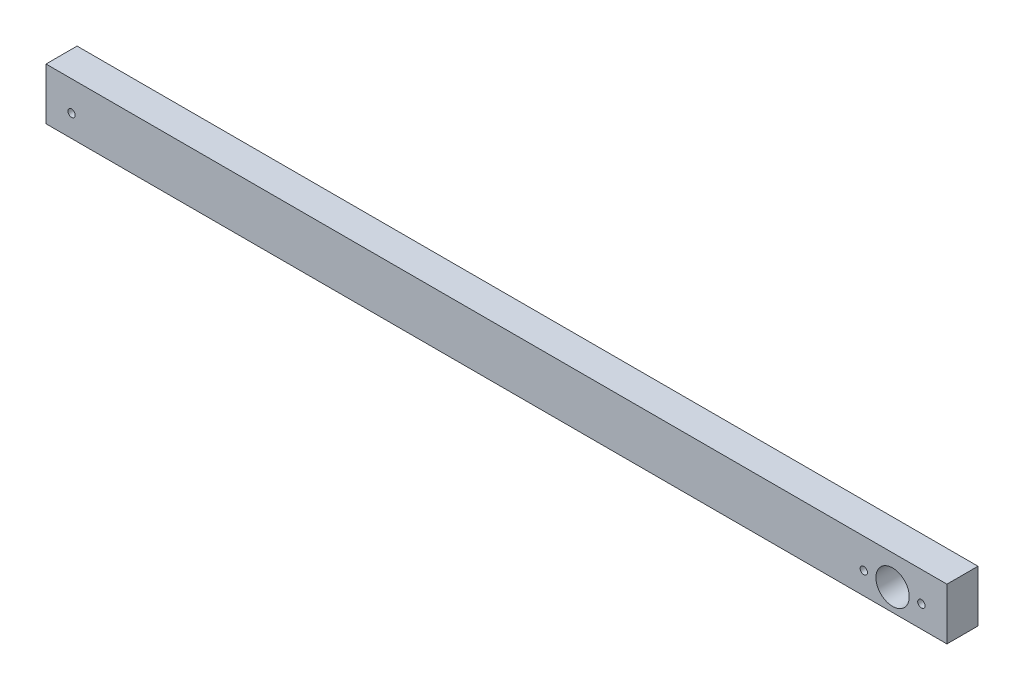
ISO-10303-21;
HEADER;
FILE_DESCRIPTION(('STEP AP214'),'2;1');
FILE_NAME('part.step','',(''),(''),'','','');
FILE_SCHEMA(('AUTOMOTIVE_DESIGN { 1 0 10303 214 1 1 1 1 }'));
ENDSEC;
DATA;
#1=APPLICATION_CONTEXT('core data for automotive mechanical design processes');
#2=APPLICATION_PROTOCOL_DEFINITION('international standard','automotive_design',2000,#1);
#3=PRODUCT_CONTEXT('',#1,'mechanical');
#4=PRODUCT('Part','Part','',(#3));
#5=PRODUCT_RELATED_PRODUCT_CATEGORY('part','',(#4));
#6=PRODUCT_DEFINITION_FORMATION('','',#4);
#7=PRODUCT_DEFINITION_CONTEXT('part definition',#1,'design');
#8=PRODUCT_DEFINITION('design','',#6,#7);
#9=PRODUCT_DEFINITION_SHAPE('','',#8);
#10=(LENGTH_UNIT() NAMED_UNIT(*) SI_UNIT(.MILLI.,.METRE.));
#11=(NAMED_UNIT(*) PLANE_ANGLE_UNIT() SI_UNIT($,.RADIAN.));
#12=(NAMED_UNIT(*) SI_UNIT($,.STERADIAN.) SOLID_ANGLE_UNIT());
#13=UNCERTAINTY_MEASURE_WITH_UNIT(LENGTH_MEASURE(1.E-05),#10,'distance_accuracy_value','');
#14=(GEOMETRIC_REPRESENTATION_CONTEXT(3) GLOBAL_UNCERTAINTY_ASSIGNED_CONTEXT((#13)) GLOBAL_UNIT_ASSIGNED_CONTEXT((#10,
#11,#12)) REPRESENTATION_CONTEXT('',''));
#15=CARTESIAN_POINT('',(0.,0.,0.));
#16=DIRECTION('',(0.,0.,1.));
#17=DIRECTION('',(1.,0.,0.));
#18=AXIS2_PLACEMENT_3D('',#15,#16,#17);
#19=CARTESIAN_POINT('',(276.225,31.75,9.525));
#20=DIRECTION('',(-1.,0.,0.));
#21=DIRECTION('',(0.,0.,1.));
#22=AXIS2_PLACEMENT_3D('',#19,#20,#21);
#23=PLANE('',#22);
#24=DIRECTION('',(0.,0.,-1.));
#25=VECTOR('',#24,1.);
#26=CARTESIAN_POINT('',(276.225,0.,9.525));
#27=LINE('',#26,#25);
#28=CARTESIAN_POINT('',(276.225,0.,9.525));
#29=VERTEX_POINT('',#28);
#30=CARTESIAN_POINT('',(276.225,0.,-9.525));
#31=VERTEX_POINT('',#30);
#32=EDGE_CURVE('E98',#29,#31,#27,.T.);
#33=ORIENTED_EDGE('',*,*,#32,.T.);
#34=DIRECTION('',(0.,-1.,0.));
#35=VECTOR('',#34,1.);
#36=CARTESIAN_POINT('',(276.225,31.75,-9.525));
#37=LINE('',#36,#35);
#38=CARTESIAN_POINT('',(276.225,31.75,-9.525));
#39=VERTEX_POINT('',#38);
#40=EDGE_CURVE('E11',#39,#31,#37,.T.);
#41=ORIENTED_EDGE('',*,*,#40,.F.);
#42=DIRECTION('',(0.,0.,-1.));
#43=VECTOR('',#42,1.);
#44=CARTESIAN_POINT('',(276.225,31.75,9.525));
#45=LINE('',#44,#43);
#46=CARTESIAN_POINT('',(276.225,31.75,9.525));
#47=VERTEX_POINT('',#46);
#48=EDGE_CURVE('E86',#47,#39,#45,.T.);
#49=ORIENTED_EDGE('',*,*,#48,.F.);
#50=DIRECTION('',(0.,-1.,0.));
#51=VECTOR('',#50,1.);
#52=CARTESIAN_POINT('',(276.225,31.75,9.525));
#53=LINE('',#52,#51);
#54=EDGE_CURVE('E94',#47,#29,#53,.T.);
#55=ORIENTED_EDGE('',*,*,#54,.T.);
#56=EDGE_LOOP('',(#33,#41,#49,#55));
#57=FACE_BOUND('',#56,.T.);
#58=ADVANCED_FACE('F35',(#57),#23,.F.);
#59=CARTESIAN_POINT('',(-276.225,31.75,-9.525));
#60=DIRECTION('',(0.,0.,1.));
#61=DIRECTION('',(1.,0.,0.));
#62=AXIS2_PLACEMENT_3D('',#59,#60,#61);
#63=PLANE('',#62);
#64=CARTESIAN_POINT('',(-260.54685,13.4937499999999,-9.525));
#65=DIRECTION('',(0.,0.,-1.));
#66=DIRECTION('',(-1.,0.,0.));
#67=AXIS2_PLACEMENT_3D('',#64,#65,#66);
#68=CIRCLE('',#67,4.21640000000001);
#69=CARTESIAN_POINT('',(-264.76325,13.4937499999999,-9.525));
#70=VERTEX_POINT('',#69);
#71=EDGE_CURVE('E141',#70,#70,#68,.T.);
#72=ORIENTED_EDGE('',*,*,#71,.F.);
#73=EDGE_LOOP('',(#72));
#74=FACE_BOUND('',#73,.T.);
#75=CARTESIAN_POINT('',(260.54685,13.4937499999999,-9.525));
#76=DIRECTION('',(0.,0.,-1.));
#77=DIRECTION('',(-1.,0.,0.));
#78=AXIS2_PLACEMENT_3D('',#75,#76,#77);
#79=CIRCLE('',#78,4.55929999999999);
#80=CARTESIAN_POINT('',(255.98755,13.4937499999999,-9.525));
#81=VERTEX_POINT('',#80);
#82=EDGE_CURVE('E132',#81,#81,#79,.T.);
#83=ORIENTED_EDGE('',*,*,#82,.F.);
#84=EDGE_LOOP('',(#83));
#85=FACE_BOUND('',#84,.T.);
#86=CARTESIAN_POINT('',(225.22815,13.4937499999999,-9.525));
#87=DIRECTION('',(0.,0.,-1.));
#88=DIRECTION('',(-1.,0.,0.));
#89=AXIS2_PLACEMENT_3D('',#86,#87,#88);
#90=CIRCLE('',#89,4.55929999999999);
#91=CARTESIAN_POINT('',(220.66885,13.4937499999999,-9.525));
#92=VERTEX_POINT('',#91);
#93=EDGE_CURVE('E123',#92,#92,#90,.T.);
#94=ORIENTED_EDGE('',*,*,#93,.F.);
#95=EDGE_LOOP('',(#94));
#96=FACE_BOUND('',#95,.T.);
#97=CARTESIAN_POINT('',(242.8875,13.4937499999999,-9.525));
#98=DIRECTION('',(0.,0.,-1.));
#99=DIRECTION('',(-1.,0.,0.));
#100=AXIS2_PLACEMENT_3D('',#97,#98,#99);
#101=CIRCLE('',#100,10.2235);
#102=CARTESIAN_POINT('',(232.664,13.4937499999999,-9.525));
#103=VERTEX_POINT('',#102);
#104=EDGE_CURVE('E112',#103,#103,#101,.T.);
#105=ORIENTED_EDGE('',*,*,#104,.F.);
#106=EDGE_LOOP('',(#105));
#107=FACE_BOUND('',#106,.T.);
#108=DIRECTION('',(-1.,0.,0.));
#109=VECTOR('',#108,1.);
#110=CARTESIAN_POINT('',(-276.225,0.,-9.525));
#111=LINE('',#110,#109);
#112=CARTESIAN_POINT('',(-276.225,0.,-9.525));
#113=VERTEX_POINT('',#112);
#114=EDGE_CURVE('E90',#31,#113,#111,.T.);
#115=ORIENTED_EDGE('',*,*,#114,.T.);
#116=DIRECTION('',(0.,-1.,0.));
#117=VECTOR('',#116,1.);
#118=CARTESIAN_POINT('',(-276.225,31.75,-9.525));
#119=LINE('',#118,#117);
#120=CARTESIAN_POINT('',(-276.225,31.75,-9.525));
#121=VERTEX_POINT('',#120);
#122=EDGE_CURVE('E43',#121,#113,#119,.T.);
#123=ORIENTED_EDGE('',*,*,#122,.F.);
#124=DIRECTION('',(-1.,0.,0.));
#125=VECTOR('',#124,1.);
#126=CARTESIAN_POINT('',(-276.225,31.75,-9.525));
#127=LINE('',#126,#125);
#128=EDGE_CURVE('E81',#39,#121,#127,.T.);
#129=ORIENTED_EDGE('',*,*,#128,.F.);
#130=ORIENTED_EDGE('',*,*,#40,.T.);
#131=EDGE_LOOP('',(#115,#123,#129,#130));
#132=FACE_BOUND('',#131,.T.);
#133=ADVANCED_FACE('F89',(#74,#85,#96,#107,#132),#63,.F.);
#134=CARTESIAN_POINT('',(-276.225,31.75,9.525));
#135=DIRECTION('',(1.,0.,0.));
#136=DIRECTION('',(0.,0.,-1.));
#137=AXIS2_PLACEMENT_3D('',#134,#135,#136);
#138=PLANE('',#137);
#139=DIRECTION('',(0.,0.,1.));
#140=VECTOR('',#139,1.);
#141=CARTESIAN_POINT('',(-276.225,0.,9.525));
#142=LINE('',#141,#140);
#143=CARTESIAN_POINT('',(-276.225,0.,9.525));
#144=VERTEX_POINT('',#143);
#145=EDGE_CURVE('E68',#113,#144,#142,.T.);
#146=ORIENTED_EDGE('',*,*,#145,.T.);
#147=DIRECTION('',(0.,-1.,0.));
#148=VECTOR('',#147,1.);
#149=CARTESIAN_POINT('',(-276.225,31.75,9.525));
#150=LINE('',#149,#148);
#151=CARTESIAN_POINT('',(-276.225,31.75,9.525));
#152=VERTEX_POINT('',#151);
#153=EDGE_CURVE('E91',#152,#144,#150,.T.);
#154=ORIENTED_EDGE('',*,*,#153,.F.);
#155=DIRECTION('',(0.,0.,1.));
#156=VECTOR('',#155,1.);
#157=CARTESIAN_POINT('',(-276.225,31.75,9.525));
#158=LINE('',#157,#156);
#159=EDGE_CURVE('E84',#121,#152,#158,.T.);
#160=ORIENTED_EDGE('',*,*,#159,.F.);
#161=ORIENTED_EDGE('',*,*,#122,.T.);
#162=EDGE_LOOP('',(#146,#154,#160,#161));
#163=FACE_BOUND('',#162,.T.);
#164=ADVANCED_FACE('F92',(#163),#138,.F.);
#165=CARTESIAN_POINT('',(-276.225,31.75,9.525));
#166=DIRECTION('',(0.,0.,-1.));
#167=DIRECTION('',(-1.,0.,0.));
#168=AXIS2_PLACEMENT_3D('',#165,#166,#167);
#169=PLANE('',#168);
#170=CARTESIAN_POINT('',(-260.54685,13.4937499999999,9.525));
#171=DIRECTION('',(0.,0.,-1.));
#172=DIRECTION('',(-1.,0.,0.));
#173=AXIS2_PLACEMENT_3D('',#170,#171,#172);
#174=CIRCLE('',#173,2.24789999999997);
#175=CARTESIAN_POINT('',(-262.79475,13.4937499999999,9.525));
#176=VERTEX_POINT('',#175);
#177=EDGE_CURVE('E135',#176,#176,#174,.T.);
#178=ORIENTED_EDGE('',*,*,#177,.T.);
#179=EDGE_LOOP('',(#178));
#180=FACE_BOUND('',#179,.T.);
#181=CARTESIAN_POINT('',(260.54685,13.4937499999999,9.525));
#182=DIRECTION('',(0.,0.,-1.));
#183=DIRECTION('',(-1.,0.,0.));
#184=AXIS2_PLACEMENT_3D('',#181,#182,#183);
#185=CIRCLE('',#184,2.24789999999997);
#186=CARTESIAN_POINT('',(258.29895,13.4937499999999,9.525));
#187=VERTEX_POINT('',#186);
#188=EDGE_CURVE('E126',#187,#187,#185,.T.);
#189=ORIENTED_EDGE('',*,*,#188,.T.);
#190=EDGE_LOOP('',(#189));
#191=FACE_BOUND('',#190,.T.);
#192=CARTESIAN_POINT('',(225.22815,13.4937499999999,9.525));
#193=DIRECTION('',(0.,0.,-1.));
#194=DIRECTION('',(-1.,0.,0.));
#195=AXIS2_PLACEMENT_3D('',#192,#193,#194);
#196=CIRCLE('',#195,2.2479);
#197=CARTESIAN_POINT('',(222.98025,13.4937499999999,9.525));
#198=VERTEX_POINT('',#197);
#199=EDGE_CURVE('E115',#198,#198,#196,.T.);
#200=ORIENTED_EDGE('',*,*,#199,.T.);
#201=EDGE_LOOP('',(#200));
#202=FACE_BOUND('',#201,.T.);
#203=CARTESIAN_POINT('',(242.8875,13.4937499999999,9.525));
#204=DIRECTION('',(0.,0.,-1.));
#205=DIRECTION('',(-1.,0.,0.));
#206=AXIS2_PLACEMENT_3D('',#203,#204,#205);
#207=CIRCLE('',#206,10.2235);
#208=CARTESIAN_POINT('',(232.664,13.4937499999999,9.525));
#209=VERTEX_POINT('',#208);
#210=EDGE_CURVE('E101',#209,#209,#207,.T.);
#211=ORIENTED_EDGE('',*,*,#210,.T.);
#212=EDGE_LOOP('',(#211));
#213=FACE_BOUND('',#212,.T.);
#214=DIRECTION('',(1.,0.,0.));
#215=VECTOR('',#214,1.);
#216=CARTESIAN_POINT('',(-276.225,0.,9.525));
#217=LINE('',#216,#215);
#218=EDGE_CURVE('E74',#144,#29,#217,.T.);
#219=ORIENTED_EDGE('',*,*,#218,.T.);
#220=ORIENTED_EDGE('',*,*,#54,.F.);
#221=DIRECTION('',(1.,0.,0.));
#222=VECTOR('',#221,1.);
#223=CARTESIAN_POINT('',(-276.225,31.75,9.525));
#224=LINE('',#223,#222);
#225=EDGE_CURVE('E51',#152,#47,#224,.T.);
#226=ORIENTED_EDGE('',*,*,#225,.F.);
#227=ORIENTED_EDGE('',*,*,#153,.T.);
#228=EDGE_LOOP('',(#219,#220,#226,#227));
#229=FACE_BOUND('',#228,.T.);
#230=ADVANCED_FACE('F106',(#180,#191,#202,#213,#229),#169,.F.);
#231=CARTESIAN_POINT('',(0.,31.75,0.));
#232=DIRECTION('',(0.,-1.,0.));
#233=DIRECTION('',(0.,0.,-1.));
#234=AXIS2_PLACEMENT_3D('',#231,#232,#233);
#235=PLANE('',#234);
#236=ORIENTED_EDGE('',*,*,#48,.T.);
#237=ORIENTED_EDGE('',*,*,#128,.T.);
#238=ORIENTED_EDGE('',*,*,#159,.T.);
#239=ORIENTED_EDGE('',*,*,#225,.T.);
#240=EDGE_LOOP('',(#236,#237,#238,#239));
#241=FACE_BOUND('',#240,.T.);
#242=ADVANCED_FACE('F82',(#241),#235,.F.);
#243=CARTESIAN_POINT('',(0.,0.,0.));
#244=DIRECTION('',(0.,-1.,0.));
#245=DIRECTION('',(0.,0.,-1.));
#246=AXIS2_PLACEMENT_3D('',#243,#244,#245);
#247=PLANE('',#246);
#248=ORIENTED_EDGE('',*,*,#32,.F.);
#249=ORIENTED_EDGE('',*,*,#218,.F.);
#250=ORIENTED_EDGE('',*,*,#145,.F.);
#251=ORIENTED_EDGE('',*,*,#114,.F.);
#252=EDGE_LOOP('',(#248,#249,#250,#251));
#253=FACE_BOUND('',#252,.T.);
#254=ADVANCED_FACE('F109',(#253),#247,.T.);
#255=CARTESIAN_POINT('',(242.8875,13.4937499999999,9.525));
#256=DIRECTION('',(0.,0.,-1.));
#257=DIRECTION('',(-1.,0.,0.));
#258=AXIS2_PLACEMENT_3D('',#255,#256,#257);
#259=CYLINDRICAL_SURFACE('',#258,10.2235);
#260=CARTESIAN_POINT('',(232.664,13.4937499999999,9.525));
#261=CARTESIAN_POINT('',(232.664,13.4937499999999,9.3265625));
#262=CARTESIAN_POINT('',(232.664,13.4937499999999,9.128125));
#263=CARTESIAN_POINT('',(232.664,13.4937499999999,8.73125));
#264=CARTESIAN_POINT('',(232.664,13.4937499999999,8.5328125));
#265=CARTESIAN_POINT('',(232.664,13.4937499999999,8.1359375));
#266=CARTESIAN_POINT('',(232.664,13.4937499999999,7.9375));
#267=CARTESIAN_POINT('',(232.664,13.4937499999999,7.540625));
#268=CARTESIAN_POINT('',(232.664,13.4937499999999,7.3421875));
#269=CARTESIAN_POINT('',(232.664,13.4937499999999,6.9453125));
#270=CARTESIAN_POINT('',(232.664,13.4937499999999,6.746875));
#271=CARTESIAN_POINT('',(232.664,13.4937499999999,6.35));
#272=CARTESIAN_POINT('',(232.664,13.4937499999999,6.1515625));
#273=CARTESIAN_POINT('',(232.664,13.4937499999999,5.7546875));
#274=CARTESIAN_POINT('',(232.664,13.4937499999999,5.55625));
#275=CARTESIAN_POINT('',(232.664,13.4937499999999,5.159375));
#276=CARTESIAN_POINT('',(232.664,13.4937499999999,4.9609375));
#277=CARTESIAN_POINT('',(232.664,13.4937499999999,4.5640625));
#278=CARTESIAN_POINT('',(232.664,13.4937499999999,4.365625));
#279=CARTESIAN_POINT('',(232.664,13.4937499999999,3.96875));
#280=CARTESIAN_POINT('',(232.664,13.4937499999999,3.7703125));
#281=CARTESIAN_POINT('',(232.664,13.4937499999999,3.3734375));
#282=CARTESIAN_POINT('',(232.664,13.4937499999999,3.175));
#283=CARTESIAN_POINT('',(232.664,13.4937499999999,2.778125));
#284=CARTESIAN_POINT('',(232.664,13.4937499999999,2.5796875));
#285=CARTESIAN_POINT('',(232.664,13.4937499999999,2.1828125));
#286=CARTESIAN_POINT('',(232.664,13.4937499999999,1.984375));
#287=CARTESIAN_POINT('',(232.664,13.4937499999999,1.5875));
#288=CARTESIAN_POINT('',(232.664,13.4937499999999,1.3890625));
#289=CARTESIAN_POINT('',(232.664,13.4937499999999,0.992187500000001));
#290=CARTESIAN_POINT('',(232.664,13.4937499999999,0.793750000000001));
#291=CARTESIAN_POINT('',(232.664,13.4937499999999,0.396875));
#292=CARTESIAN_POINT('',(232.664,13.4937499999999,0.1984375));
#293=CARTESIAN_POINT('',(232.664,13.4937499999999,-0.1984375));
#294=CARTESIAN_POINT('',(232.664,13.4937499999999,-0.396875));
#295=CARTESIAN_POINT('',(232.664,13.4937499999999,-0.793750000000001));
#296=CARTESIAN_POINT('',(232.664,13.4937499999999,-0.992187500000001));
#297=CARTESIAN_POINT('',(232.664,13.4937499999999,-1.3890625));
#298=CARTESIAN_POINT('',(232.664,13.4937499999999,-1.5875));
#299=CARTESIAN_POINT('',(232.664,13.4937499999999,-1.984375));
#300=CARTESIAN_POINT('',(232.664,13.4937499999999,-2.1828125));
#301=CARTESIAN_POINT('',(232.664,13.4937499999999,-2.5796875));
#302=CARTESIAN_POINT('',(232.664,13.4937499999999,-2.778125));
#303=CARTESIAN_POINT('',(232.664,13.4937499999999,-3.175));
#304=CARTESIAN_POINT('',(232.664,13.4937499999999,-3.3734375));
#305=CARTESIAN_POINT('',(232.664,13.4937499999999,-3.7703125));
#306=CARTESIAN_POINT('',(232.664,13.4937499999999,-3.96875));
#307=CARTESIAN_POINT('',(232.664,13.4937499999999,-4.365625));
#308=CARTESIAN_POINT('',(232.664,13.4937499999999,-4.5640625));
#309=CARTESIAN_POINT('',(232.664,13.4937499999999,-4.9609375));
#310=CARTESIAN_POINT('',(232.664,13.4937499999999,-5.159375));
#311=CARTESIAN_POINT('',(232.664,13.4937499999999,-5.55625));
#312=CARTESIAN_POINT('',(232.664,13.4937499999999,-5.7546875));
#313=CARTESIAN_POINT('',(232.664,13.4937499999999,-6.1515625));
#314=CARTESIAN_POINT('',(232.664,13.4937499999999,-6.35));
#315=CARTESIAN_POINT('',(232.664,13.4937499999999,-6.746875));
#316=CARTESIAN_POINT('',(232.664,13.4937499999999,-6.9453125));
#317=CARTESIAN_POINT('',(232.664,13.4937499999999,-7.3421875));
#318=CARTESIAN_POINT('',(232.664,13.4937499999999,-7.540625));
#319=CARTESIAN_POINT('',(232.664,13.4937499999999,-7.9375));
#320=CARTESIAN_POINT('',(232.664,13.4937499999999,-8.1359375));
#321=CARTESIAN_POINT('',(232.664,13.4937499999999,-8.5328125));
#322=CARTESIAN_POINT('',(232.664,13.4937499999999,-8.73125));
#323=CARTESIAN_POINT('',(232.664,13.4937499999999,-9.128125));
#324=CARTESIAN_POINT('',(232.664,13.4937499999999,-9.3265625));
#325=CARTESIAN_POINT('',(232.664,13.4937499999999,-9.525));
#326=B_SPLINE_CURVE_WITH_KNOTS('',3,(#260,#261,#262,#263,#264,#265,#266,#267,#268,#269,#270,
#271,#272,#273,#274,#275,#276,#277,#278,#279,#280,#281,#282,#283,#284,#285,#286,#287,#288,#289,
#290,#291,#292,#293,#294,#295,#296,#297,#298,#299,#300,#301,#302,#303,#304,#305,#306,#307,#308,
#309,#310,#311,#312,#313,#314,#315,#316,#317,#318,#319,#320,#321,#322,#323,#324,#325),
.UNSPECIFIED.,.F.,.F.,(4,2,2,2,2,2,2,2,2,2,2,2,2,2,2,2,2,2,2,2,2,2,2,2,2,2,2,2,2,2,2,2,4),(0.,
0.595312499999999,1.190625,1.7859375,2.38125,2.9765625,3.571875,4.1671875,4.7625,5.3578125,
5.953125,6.5484375,7.14375,7.7390625,8.334375,8.9296875,9.525,10.1203125,10.715625,11.3109375,
11.90625,12.5015625,13.096875,13.6921875,14.2875,14.8828125,15.478125,16.0734375,16.66875,
17.2640625,17.859375,18.4546875,19.05),.UNSPECIFIED.);
#327=EDGE_CURVE('BSEAM155',#209,#103,#326,.T.);
#328=ORIENTED_EDGE('',*,*,#210,.F.);
#329=ORIENTED_EDGE('',*,*,#104,.T.);
#330=ORIENTED_EDGE('',*,*,#327,.T.);
#331=ORIENTED_EDGE('',*,*,#327,.F.);
#332=EDGE_LOOP('',(#328,#330,#329,#331));
#333=FACE_BOUND('',#332,.T.);
#334=ADVANCED_FACE('F155',(#333),#259,.F.);
#335=CARTESIAN_POINT('',(225.22815,13.4937499999999,-9.525));
#336=DIRECTION('',(0.,0.,-1.));
#337=DIRECTION('',(-1.,0.,0.));
#338=AXIS2_PLACEMENT_3D('',#335,#336,#337);
#339=CYLINDRICAL_SURFACE('',#338,2.2479);
#340=ORIENTED_EDGE('',*,*,#199,.F.);
#341=EDGE_LOOP('',(#340));
#342=FACE_BOUND('',#341,.T.);
#343=CARTESIAN_POINT('',(225.22815,13.4937499999999,-6.86603846354936));
#344=DIRECTION('',(0.,0.,-1.));
#345=DIRECTION('',(-1.,0.,0.));
#346=AXIS2_PLACEMENT_3D('',#343,#344,#345);
#347=CIRCLE('',#346,2.2479);
#348=CARTESIAN_POINT('',(222.98025,13.4937499999999,-6.86603846354936));
#349=VERTEX_POINT('',#348);
#350=EDGE_CURVE('E120',#349,#349,#347,.T.);
#351=ORIENTED_EDGE('',*,*,#350,.T.);
#352=EDGE_LOOP('',(#351));
#353=FACE_BOUND('',#352,.T.);
#354=ADVANCED_FACE('F157',(#342,#353),#339,.F.);
#355=CARTESIAN_POINT('',(225.22815,13.4937499999999,-9.525));
#356=DIRECTION('',(0.,0.,-1.));
#357=DIRECTION('',(-1.,0.,0.));
#358=AXIS2_PLACEMENT_3D('',#355,#356,#357);
#359=CONICAL_SURFACE('',#358,4.55929999999999,0.715584993317673);
#360=ORIENTED_EDGE('',*,*,#350,.F.);
#361=EDGE_LOOP('',(#360));
#362=FACE_BOUND('',#361,.T.);
#363=ORIENTED_EDGE('',*,*,#93,.T.);
#364=EDGE_LOOP('',(#363));
#365=FACE_BOUND('',#364,.T.);
#366=ADVANCED_FACE('F164',(#362,#365),#359,.F.);
#367=CARTESIAN_POINT('',(260.54685,13.4937499999999,-9.525));
#368=DIRECTION('',(0.,0.,-1.));
#369=DIRECTION('',(-1.,0.,0.));
#370=AXIS2_PLACEMENT_3D('',#367,#368,#369);
#371=CYLINDRICAL_SURFACE('',#370,2.2479);
#372=ORIENTED_EDGE('',*,*,#188,.F.);
#373=EDGE_LOOP('',(#372));
#374=FACE_BOUND('',#373,.T.);
#375=CARTESIAN_POINT('',(260.54685,13.4937499999999,-6.86603846354936));
#376=DIRECTION('',(0.,0.,-1.));
#377=DIRECTION('',(-1.,0.,0.));
#378=AXIS2_PLACEMENT_3D('',#375,#376,#377);
#379=CIRCLE('',#378,2.24790000000002);
#380=CARTESIAN_POINT('',(258.29895,13.4937499999999,-6.86603846354936));
#381=VERTEX_POINT('',#380);
#382=EDGE_CURVE('E129',#381,#381,#379,.T.);
#383=ORIENTED_EDGE('',*,*,#382,.T.);
#384=EDGE_LOOP('',(#383));
#385=FACE_BOUND('',#384,.T.);
#386=ADVANCED_FACE('F224',(#374,#385),#371,.F.);
#387=CARTESIAN_POINT('',(260.54685,13.4937499999999,-9.525));
#388=DIRECTION('',(0.,0.,-1.));
#389=DIRECTION('',(-1.,0.,0.));
#390=AXIS2_PLACEMENT_3D('',#387,#388,#389);
#391=CONICAL_SURFACE('',#390,4.55929999999999,0.715584993317667);
#392=ORIENTED_EDGE('',*,*,#382,.F.);
#393=EDGE_LOOP('',(#392));
#394=FACE_BOUND('',#393,.T.);
#395=ORIENTED_EDGE('',*,*,#82,.T.);
#396=EDGE_LOOP('',(#395));
#397=FACE_BOUND('',#396,.T.);
#398=ADVANCED_FACE('F233',(#394,#397),#391,.F.);
#399=CARTESIAN_POINT('',(-260.54685,13.4937499999999,-9.525));
#400=DIRECTION('',(0.,0.,-1.));
#401=DIRECTION('',(-1.,0.,0.));
#402=AXIS2_PLACEMENT_3D('',#399,#400,#401);
#403=CYLINDRICAL_SURFACE('',#402,2.2479);
#404=ORIENTED_EDGE('',*,*,#177,.F.);
#405=EDGE_LOOP('',(#404));
#406=FACE_BOUND('',#405,.T.);
#407=CARTESIAN_POINT('',(-260.54685,13.4937499999999,-7.26049979038544));
#408=DIRECTION('',(0.,0.,-1.));
#409=DIRECTION('',(-1.,0.,0.));
#410=AXIS2_PLACEMENT_3D('',#407,#408,#409);
#411=CIRCLE('',#410,2.24790000000002);
#412=CARTESIAN_POINT('',(-262.79475,13.4937499999999,-7.26049979038544));
#413=VERTEX_POINT('',#412);
#414=EDGE_CURVE('E138',#413,#413,#411,.T.);
#415=ORIENTED_EDGE('',*,*,#414,.T.);
#416=EDGE_LOOP('',(#415));
#417=FACE_BOUND('',#416,.T.);
#418=ADVANCED_FACE('F242',(#406,#417),#403,.F.);
#419=CARTESIAN_POINT('',(-260.54685,13.4937499999999,-9.525));
#420=DIRECTION('',(0.,0.,-1.));
#421=DIRECTION('',(-1.,0.,0.));
#422=AXIS2_PLACEMENT_3D('',#419,#420,#421);
#423=CONICAL_SURFACE('',#422,4.21640000000001,0.715584993317671);
#424=ORIENTED_EDGE('',*,*,#414,.F.);
#425=EDGE_LOOP('',(#424));
#426=FACE_BOUND('',#425,.T.);
#427=ORIENTED_EDGE('',*,*,#71,.T.);
#428=EDGE_LOOP('',(#427));
#429=FACE_BOUND('',#428,.T.);
#430=ADVANCED_FACE('F145',(#426,#429),#423,.F.);
#431=CLOSED_SHELL('',(#58,#133,#164,#230,#242,#254,#334,#354,#366,#386,#398,#418,#430));
#432=MANIFOLD_SOLID_BREP('B2',#431);
#433=ADVANCED_BREP_SHAPE_REPRESENTATION('',(#18,#432),#14);
#434=SHAPE_DEFINITION_REPRESENTATION(#9,#433);
ENDSEC;
END-ISO-10303-21;
